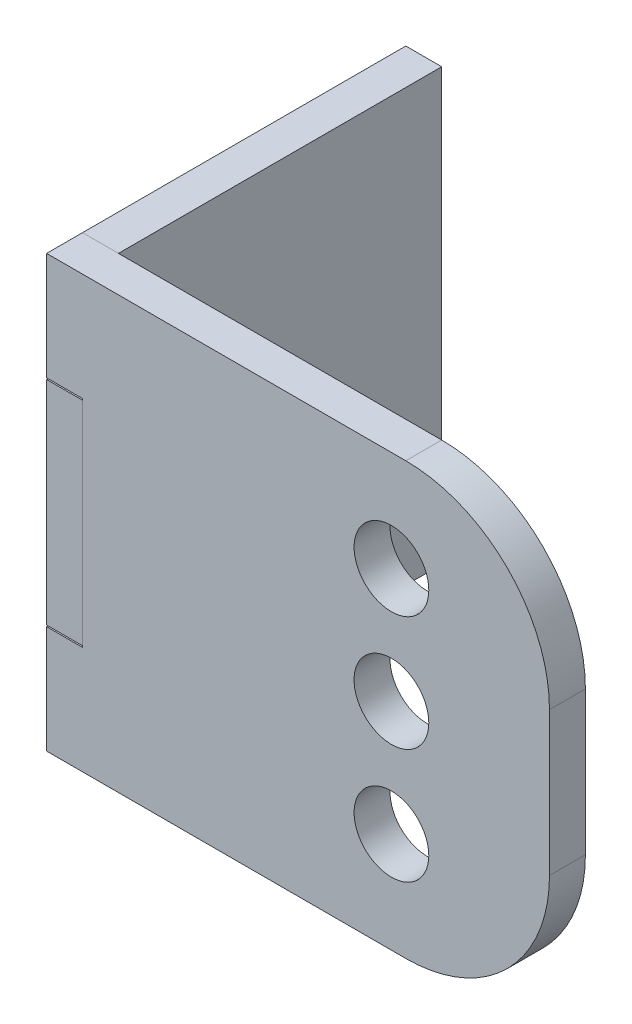
ISO-10303-21;
HEADER;
FILE_DESCRIPTION(('STEP AP214'),'2;1');
FILE_NAME('part.step','',(''),(''),'','','');
FILE_SCHEMA(('AUTOMOTIVE_DESIGN { 1 0 10303 214 1 1 1 1 }'));
ENDSEC;
DATA;
#1=APPLICATION_CONTEXT('core data for automotive mechanical design processes');
#2=APPLICATION_PROTOCOL_DEFINITION('international standard','automotive_design',2000,#1);
#3=PRODUCT_CONTEXT('',#1,'mechanical');
#4=PRODUCT('Part','Part','',(#3));
#5=PRODUCT_RELATED_PRODUCT_CATEGORY('part','',(#4));
#6=PRODUCT_DEFINITION_FORMATION('','',#4);
#7=PRODUCT_DEFINITION_CONTEXT('part definition',#1,'design');
#8=PRODUCT_DEFINITION('design','',#6,#7);
#9=PRODUCT_DEFINITION_SHAPE('','',#8);
#10=(LENGTH_UNIT() NAMED_UNIT(*) SI_UNIT(.MILLI.,.METRE.));
#11=(NAMED_UNIT(*) PLANE_ANGLE_UNIT() SI_UNIT($,.RADIAN.));
#12=(NAMED_UNIT(*) SI_UNIT($,.STERADIAN.) SOLID_ANGLE_UNIT());
#13=UNCERTAINTY_MEASURE_WITH_UNIT(LENGTH_MEASURE(1.E-05),#10,'distance_accuracy_value','');
#14=(GEOMETRIC_REPRESENTATION_CONTEXT(3) GLOBAL_UNCERTAINTY_ASSIGNED_CONTEXT((#13)) GLOBAL_UNIT_ASSIGNED_CONTEXT((#10,
#11,#12)) REPRESENTATION_CONTEXT('',''));
#15=CARTESIAN_POINT('',(0.,0.,0.));
#16=DIRECTION('',(0.,0.,1.));
#17=DIRECTION('',(1.,0.,0.));
#18=AXIS2_PLACEMENT_3D('',#15,#16,#17);
#19=CARTESIAN_POINT('',(0.,0.,0.));
#20=DIRECTION('',(0.,0.,-1.));
#21=DIRECTION('',(-1.,0.,0.));
#22=AXIS2_PLACEMENT_3D('',#19,#20,#21);
#23=PLANE('',#22);
#24=DIRECTION('',(-1.,0.,0.));
#25=VECTOR('',#24,1.);
#26=CARTESIAN_POINT('',(0.,9.398,0.));
#27=LINE('',#26,#25);
#28=CARTESIAN_POINT('',(3.17499999999999,9.398,0.));
#29=VERTEX_POINT('',#28);
#30=CARTESIAN_POINT('',(0.,9.398,0.));
#31=VERTEX_POINT('',#30);
#32=EDGE_CURVE('E76',#29,#31,#27,.T.);
#33=ORIENTED_EDGE('',*,*,#32,.F.);
#34=DIRECTION('',(0.,-1.,0.));
#35=VECTOR('',#34,1.);
#36=CARTESIAN_POINT('',(3.17499999999999,0.,0.));
#37=LINE('',#36,#35);
#38=CARTESIAN_POINT('',(3.17499999999999,19.05,0.));
#39=VERTEX_POINT('',#38);
#40=EDGE_CURVE('E170',#39,#29,#37,.T.);
#41=ORIENTED_EDGE('',*,*,#40,.F.);
#42=DIRECTION('',(1.,0.,0.));
#43=VECTOR('',#42,1.);
#44=CARTESIAN_POINT('',(0.,19.05,0.));
#45=LINE('',#44,#43);
#46=CARTESIAN_POINT('',(0.,19.05,0.));
#47=VERTEX_POINT('',#46);
#48=EDGE_CURVE('E168',#47,#39,#45,.T.);
#49=ORIENTED_EDGE('',*,*,#48,.F.);
#50=DIRECTION('',(0.,1.,0.));
#51=VECTOR('',#50,1.);
#52=CARTESIAN_POINT('',(0.,0.,0.));
#53=LINE('',#52,#51);
#54=EDGE_CURVE('E149',#31,#47,#53,.T.);
#55=ORIENTED_EDGE('',*,*,#54,.F.);
#56=EDGE_LOOP('',(#33,#41,#49,#55));
#57=FACE_BOUND('',#56,.T.);
#58=ADVANCED_FACE('F53',(#57),#23,.F.);
#59=CARTESIAN_POINT('',(0.,0.,-28.575));
#60=DIRECTION('',(1.,0.,0.));
#61=DIRECTION('',(0.,0.,-1.));
#62=AXIS2_PLACEMENT_3D('',#59,#60,#61);
#63=PLANE('',#62);
#64=CARTESIAN_POINT('',(0.,-19.05,0.));
#65=VERTEX_POINT('',#64);
#66=CARTESIAN_POINT('',(0.,-9.398,0.));
#67=VERTEX_POINT('',#66);
#68=EDGE_CURVE('E165',#65,#67,#53,.T.);
#69=ORIENTED_EDGE('',*,*,#68,.T.);
#70=DIRECTION('',(0.,0.,-1.));
#71=VECTOR('',#70,1.);
#72=CARTESIAN_POINT('',(0.,-9.398,3.175));
#73=LINE('',#72,#71);
#74=CARTESIAN_POINT('',(0.,-9.398,3.175));
#75=VERTEX_POINT('',#74);
#76=EDGE_CURVE('E127',#75,#67,#73,.T.);
#77=ORIENTED_EDGE('',*,*,#76,.F.);
#78=DIRECTION('',(0.,-1.,0.));
#79=VECTOR('',#78,1.);
#80=CARTESIAN_POINT('',(0.,0.,3.175));
#81=LINE('',#80,#79);
#82=CARTESIAN_POINT('',(0.,9.398,3.175));
#83=VERTEX_POINT('',#82);
#84=EDGE_CURVE('E140',#83,#75,#81,.T.);
#85=ORIENTED_EDGE('',*,*,#84,.F.);
#86=DIRECTION('',(0.,0.,-1.));
#87=VECTOR('',#86,1.);
#88=CARTESIAN_POINT('',(0.,9.398,3.175));
#89=LINE('',#88,#87);
#90=EDGE_CURVE('E150',#83,#31,#89,.T.);
#91=ORIENTED_EDGE('',*,*,#90,.T.);
#92=ORIENTED_EDGE('',*,*,#54,.T.);
#93=DIRECTION('',(0.,0.,1.));
#94=VECTOR('',#93,1.);
#95=CARTESIAN_POINT('',(0.,19.05,-28.575));
#96=LINE('',#95,#94);
#97=CARTESIAN_POINT('',(0.,19.05,-28.575));
#98=VERTEX_POINT('',#97);
#99=EDGE_CURVE('E12',#98,#47,#96,.T.);
#100=ORIENTED_EDGE('',*,*,#99,.F.);
#101=DIRECTION('',(0.,1.,0.));
#102=VECTOR('',#101,1.);
#103=CARTESIAN_POINT('',(0.,0.,-28.575));
#104=LINE('',#103,#102);
#105=CARTESIAN_POINT('',(0.,-19.05,-28.575));
#106=VERTEX_POINT('',#105);
#107=EDGE_CURVE('E154',#106,#98,#104,.T.);
#108=ORIENTED_EDGE('',*,*,#107,.F.);
#109=DIRECTION('',(0.,0.,1.));
#110=VECTOR('',#109,1.);
#111=CARTESIAN_POINT('',(0.,-19.05,-28.575));
#112=LINE('',#111,#110);
#113=EDGE_CURVE('E164',#106,#65,#112,.T.);
#114=ORIENTED_EDGE('',*,*,#113,.T.);
#115=EDGE_LOOP('',(#69,#77,#85,#91,#92,#100,#108,#114));
#116=FACE_BOUND('',#115,.T.);
#117=ADVANCED_FACE('F55',(#116),#63,.F.);
#118=CARTESIAN_POINT('',(0.,19.05,-28.575));
#119=DIRECTION('',(0.,-1.,0.));
#120=DIRECTION('',(1.,0.,0.));
#121=AXIS2_PLACEMENT_3D('',#118,#119,#120);
#122=PLANE('',#121);
#123=ORIENTED_EDGE('',*,*,#48,.T.);
#124=DIRECTION('',(0.,0.,1.));
#125=VECTOR('',#124,1.);
#126=CARTESIAN_POINT('',(3.17499999999999,19.05,-28.575));
#127=LINE('',#126,#125);
#128=CARTESIAN_POINT('',(3.17499999999999,19.05,-28.575));
#129=VERTEX_POINT('',#128);
#130=EDGE_CURVE('E61',#129,#39,#127,.T.);
#131=ORIENTED_EDGE('',*,*,#130,.F.);
#132=DIRECTION('',(1.,0.,0.));
#133=VECTOR('',#132,1.);
#134=CARTESIAN_POINT('',(0.,19.05,-28.575));
#135=LINE('',#134,#133);
#136=EDGE_CURVE('E157',#98,#129,#135,.T.);
#137=ORIENTED_EDGE('',*,*,#136,.F.);
#138=ORIENTED_EDGE('',*,*,#99,.T.);
#139=EDGE_LOOP('',(#123,#131,#137,#138));
#140=FACE_BOUND('',#139,.T.);
#141=ADVANCED_FACE('F184',(#140),#122,.F.);
#142=CARTESIAN_POINT('',(3.17499999999999,0.,-28.575));
#143=DIRECTION('',(-1.,0.,0.));
#144=DIRECTION('',(0.,0.,1.));
#145=AXIS2_PLACEMENT_3D('',#142,#143,#144);
#146=PLANE('',#145);
#147=ORIENTED_EDGE('',*,*,#40,.T.);
#148=DIRECTION('',(0.,0.,-1.));
#149=VECTOR('',#148,1.);
#150=CARTESIAN_POINT('',(3.175,9.398,3.175));
#151=LINE('',#150,#149);
#152=CARTESIAN_POINT('',(3.175,9.398,3.175));
#153=VERTEX_POINT('',#152);
#154=EDGE_CURVE('E135',#153,#29,#151,.T.);
#155=ORIENTED_EDGE('',*,*,#154,.F.);
#156=DIRECTION('',(0.,1.,0.));
#157=VECTOR('',#156,1.);
#158=CARTESIAN_POINT('',(3.175,0.,3.175));
#159=LINE('',#158,#157);
#160=CARTESIAN_POINT('',(3.175,-9.398,3.175));
#161=VERTEX_POINT('',#160);
#162=EDGE_CURVE('E132',#161,#153,#159,.T.);
#163=ORIENTED_EDGE('',*,*,#162,.F.);
#164=DIRECTION('',(0.,0.,-1.));
#165=VECTOR('',#164,1.);
#166=CARTESIAN_POINT('',(3.175,-9.398,3.175));
#167=LINE('',#166,#165);
#168=CARTESIAN_POINT('',(3.17499999999999,-9.398,0.));
#169=VERTEX_POINT('',#168);
#170=EDGE_CURVE('E119',#161,#169,#167,.T.);
#171=ORIENTED_EDGE('',*,*,#170,.T.);
#172=CARTESIAN_POINT('',(3.17499999999999,-19.05,0.));
#173=VERTEX_POINT('',#172);
#174=EDGE_CURVE('E68',#169,#173,#37,.T.);
#175=ORIENTED_EDGE('',*,*,#174,.T.);
#176=DIRECTION('',(0.,0.,1.));
#177=VECTOR('',#176,1.);
#178=CARTESIAN_POINT('',(3.17499999999999,-19.05,-28.575));
#179=LINE('',#178,#177);
#180=CARTESIAN_POINT('',(3.17499999999999,-19.05,-28.575));
#181=VERTEX_POINT('',#180);
#182=EDGE_CURVE('E175',#181,#173,#179,.T.);
#183=ORIENTED_EDGE('',*,*,#182,.F.);
#184=DIRECTION('',(0.,-1.,0.));
#185=VECTOR('',#184,1.);
#186=CARTESIAN_POINT('',(3.17499999999999,0.,-28.575));
#187=LINE('',#186,#185);
#188=EDGE_CURVE('E160',#129,#181,#187,.T.);
#189=ORIENTED_EDGE('',*,*,#188,.F.);
#190=ORIENTED_EDGE('',*,*,#130,.T.);
#191=EDGE_LOOP('',(#147,#155,#163,#171,#175,#183,#189,#190));
#192=FACE_BOUND('',#191,.T.);
#193=ADVANCED_FACE('F133',(#192),#146,.F.);
#194=CARTESIAN_POINT('',(0.,-19.05,-28.575));
#195=DIRECTION('',(0.,1.,0.));
#196=DIRECTION('',(-1.,0.,0.));
#197=AXIS2_PLACEMENT_3D('',#194,#195,#196);
#198=PLANE('',#197);
#199=DIRECTION('',(-1.,0.,0.));
#200=VECTOR('',#199,1.);
#201=CARTESIAN_POINT('',(0.,-19.05,0.));
#202=LINE('',#201,#200);
#203=EDGE_CURVE('E158',#173,#65,#202,.T.);
#204=ORIENTED_EDGE('',*,*,#203,.T.);
#205=ORIENTED_EDGE('',*,*,#113,.F.);
#206=DIRECTION('',(-1.,0.,0.));
#207=VECTOR('',#206,1.);
#208=CARTESIAN_POINT('',(0.,-19.05,-28.575));
#209=LINE('',#208,#207);
#210=EDGE_CURVE('E162',#181,#106,#209,.T.);
#211=ORIENTED_EDGE('',*,*,#210,.F.);
#212=ORIENTED_EDGE('',*,*,#182,.T.);
#213=EDGE_LOOP('',(#204,#205,#211,#212));
#214=FACE_BOUND('',#213,.T.);
#215=ADVANCED_FACE('F208',(#214),#198,.F.);
#216=CARTESIAN_POINT('',(0.,0.,-28.575));
#217=DIRECTION('',(0.,0.,-1.));
#218=DIRECTION('',(-1.,0.,0.));
#219=AXIS2_PLACEMENT_3D('',#216,#217,#218);
#220=PLANE('',#219);
#221=ORIENTED_EDGE('',*,*,#107,.T.);
#222=ORIENTED_EDGE('',*,*,#136,.T.);
#223=ORIENTED_EDGE('',*,*,#188,.T.);
#224=ORIENTED_EDGE('',*,*,#210,.T.);
#225=EDGE_LOOP('',(#221,#222,#223,#224));
#226=FACE_BOUND('',#225,.T.);
#227=ADVANCED_FACE('F198',(#226),#220,.T.);
#228=ORIENTED_EDGE('',*,*,#174,.F.);
#229=DIRECTION('',(-1.,0.,0.));
#230=VECTOR('',#229,1.);
#231=CARTESIAN_POINT('',(0.,-9.398,0.));
#232=LINE('',#231,#230);
#233=EDGE_CURVE('E125',#169,#67,#232,.T.);
#234=ORIENTED_EDGE('',*,*,#233,.T.);
#235=ORIENTED_EDGE('',*,*,#68,.F.);
#236=ORIENTED_EDGE('',*,*,#203,.F.);
#237=EDGE_LOOP('',(#228,#234,#235,#236));
#238=FACE_BOUND('',#237,.T.);
#239=ADVANCED_FACE('F191',(#238),#23,.F.);
#240=CARTESIAN_POINT('',(0.,9.398,3.175));
#241=DIRECTION('',(0.,-1.,0.));
#242=DIRECTION('',(0.,0.,-1.));
#243=AXIS2_PLACEMENT_3D('',#240,#241,#242);
#244=PLANE('',#243);
#245=ORIENTED_EDGE('',*,*,#32,.T.);
#246=ORIENTED_EDGE('',*,*,#90,.F.);
#247=DIRECTION('',(-1.,0.,0.));
#248=VECTOR('',#247,1.);
#249=CARTESIAN_POINT('',(0.,9.398,3.175));
#250=LINE('',#249,#248);
#251=EDGE_CURVE('E128',#153,#83,#250,.T.);
#252=ORIENTED_EDGE('',*,*,#251,.F.);
#253=ORIENTED_EDGE('',*,*,#154,.T.);
#254=EDGE_LOOP('',(#245,#246,#252,#253));
#255=FACE_BOUND('',#254,.T.);
#256=ADVANCED_FACE('F189',(#255),#244,.F.);
#257=CARTESIAN_POINT('',(0.,-9.398,3.175));
#258=DIRECTION('',(0.,-1.,0.));
#259=DIRECTION('',(0.,0.,-1.));
#260=AXIS2_PLACEMENT_3D('',#257,#258,#259);
#261=PLANE('',#260);
#262=ORIENTED_EDGE('',*,*,#233,.F.);
#263=ORIENTED_EDGE('',*,*,#170,.F.);
#264=DIRECTION('',(-1.,0.,0.));
#265=VECTOR('',#264,1.);
#266=CARTESIAN_POINT('',(0.,-9.398,3.175));
#267=LINE('',#266,#265);
#268=EDGE_CURVE('E124',#161,#75,#267,.T.);
#269=ORIENTED_EDGE('',*,*,#268,.T.);
#270=ORIENTED_EDGE('',*,*,#76,.T.);
#271=EDGE_LOOP('',(#262,#263,#269,#270));
#272=FACE_BOUND('',#271,.T.);
#273=ADVANCED_FACE('F121',(#272),#261,.T.);
#274=CARTESIAN_POINT('',(0.,0.,3.175));
#275=DIRECTION('',(0.,0.,-1.));
#276=DIRECTION('',(-1.,0.,0.));
#277=AXIS2_PLACEMENT_3D('',#274,#275,#276);
#278=PLANE('',#277);
#279=ORIENTED_EDGE('',*,*,#162,.T.);
#280=ORIENTED_EDGE('',*,*,#251,.T.);
#281=ORIENTED_EDGE('',*,*,#84,.T.);
#282=ORIENTED_EDGE('',*,*,#268,.F.);
#283=EDGE_LOOP('',(#279,#280,#281,#282));
#284=FACE_BOUND('',#283,.T.);
#285=ADVANCED_FACE('F138',(#284),#278,.F.);
#286=CLOSED_SHELL('',(#58,#117,#141,#193,#215,#227,#239,#256,#273,#285));
#287=MANIFOLD_SOLID_BREP('B2',#286);
#288=CARTESIAN_POINT('',(3.175,0.,3.175));
#289=DIRECTION('',(1.,0.,0.));
#290=DIRECTION('',(0.,1.,0.));
#291=AXIS2_PLACEMENT_3D('',#288,#289,#290);
#292=PLANE('',#291);
#293=DIRECTION('',(0.,-1.,0.));
#294=VECTOR('',#293,1.);
#295=CARTESIAN_POINT('',(3.175,0.,0.));
#296=LINE('',#295,#294);
#297=CARTESIAN_POINT('',(3.175,9.525,0.));
#298=VERTEX_POINT('',#297);
#299=CARTESIAN_POINT('',(3.175,-9.525,0.));
#300=VERTEX_POINT('',#299);
#301=EDGE_CURVE('E441',#298,#300,#296,.T.);
#302=ORIENTED_EDGE('',*,*,#301,.T.);
#303=DIRECTION('',(0.,0.,-1.));
#304=VECTOR('',#303,1.);
#305=CARTESIAN_POINT('',(3.175,-9.525,3.175));
#306=LINE('',#305,#304);
#307=CARTESIAN_POINT('',(3.175,-9.525,3.175));
#308=VERTEX_POINT('',#307);
#309=EDGE_CURVE('E423',#308,#300,#306,.T.);
#310=ORIENTED_EDGE('',*,*,#309,.F.);
#311=DIRECTION('',(0.,-1.,0.));
#312=VECTOR('',#311,1.);
#313=CARTESIAN_POINT('',(3.175,0.,3.175));
#314=LINE('',#313,#312);
#315=CARTESIAN_POINT('',(3.175,9.525,3.175));
#316=VERTEX_POINT('',#315);
#317=EDGE_CURVE('E429',#316,#308,#314,.T.);
#318=ORIENTED_EDGE('',*,*,#317,.F.);
#319=DIRECTION('',(0.,0.,-1.));
#320=VECTOR('',#319,1.);
#321=CARTESIAN_POINT('',(3.175,9.525,3.175));
#322=LINE('',#321,#320);
#323=EDGE_CURVE('E492',#316,#298,#322,.T.);
#324=ORIENTED_EDGE('',*,*,#323,.T.);
#325=EDGE_LOOP('',(#302,#310,#318,#324));
#326=FACE_BOUND('',#325,.T.);
#327=ADVANCED_FACE('F338',(#326),#292,.F.);
#328=CARTESIAN_POINT('',(0.,-9.525,3.175));
#329=DIRECTION('',(0.,-1.,0.));
#330=DIRECTION('',(0.,0.,-1.));
#331=AXIS2_PLACEMENT_3D('',#328,#329,#330);
#332=PLANE('',#331);
#333=DIRECTION('',(-1.,0.,0.));
#334=VECTOR('',#333,1.);
#335=CARTESIAN_POINT('',(0.,-9.525,0.));
#336=LINE('',#335,#334);
#337=CARTESIAN_POINT('',(0.,-9.525,0.));
#338=VERTEX_POINT('',#337);
#339=EDGE_CURVE('E484',#300,#338,#336,.T.);
#340=ORIENTED_EDGE('',*,*,#339,.T.);
#341=DIRECTION('',(0.,0.,-1.));
#342=VECTOR('',#341,1.);
#343=CARTESIAN_POINT('',(0.,-9.525,3.175));
#344=LINE('',#343,#342);
#345=CARTESIAN_POINT('',(0.,-9.525,3.175));
#346=VERTEX_POINT('',#345);
#347=EDGE_CURVE('E426',#346,#338,#344,.T.);
#348=ORIENTED_EDGE('',*,*,#347,.F.);
#349=DIRECTION('',(-1.,0.,0.));
#350=VECTOR('',#349,1.);
#351=CARTESIAN_POINT('',(0.,-9.525,3.175));
#352=LINE('',#351,#350);
#353=EDGE_CURVE('E419',#308,#346,#352,.T.);
#354=ORIENTED_EDGE('',*,*,#353,.F.);
#355=ORIENTED_EDGE('',*,*,#309,.T.);
#356=EDGE_LOOP('',(#340,#348,#354,#355));
#357=FACE_BOUND('',#356,.T.);
#358=ADVANCED_FACE('F421',(#357),#332,.F.);
#359=CARTESIAN_POINT('',(0.,0.,3.175));
#360=DIRECTION('',(1.,0.,0.));
#361=DIRECTION('',(0.,0.,-1.));
#362=AXIS2_PLACEMENT_3D('',#359,#360,#361);
#363=PLANE('',#362);
#364=DIRECTION('',(0.,-1.,0.));
#365=VECTOR('',#364,1.);
#366=CARTESIAN_POINT('',(0.,0.,0.));
#367=LINE('',#366,#365);
#368=CARTESIAN_POINT('',(0.,-19.05,0.));
#369=VERTEX_POINT('',#368);
#370=EDGE_CURVE('E480',#338,#369,#367,.T.);
#371=ORIENTED_EDGE('',*,*,#370,.T.);
#372=DIRECTION('',(0.,0.,-1.));
#373=VECTOR('',#372,1.);
#374=CARTESIAN_POINT('',(0.,-19.05,3.175));
#375=LINE('',#374,#373);
#376=CARTESIAN_POINT('',(0.,-19.05,3.175));
#377=VERTEX_POINT('',#376);
#378=EDGE_CURVE('E446',#377,#369,#375,.T.);
#379=ORIENTED_EDGE('',*,*,#378,.F.);
#380=DIRECTION('',(0.,-1.,0.));
#381=VECTOR('',#380,1.);
#382=CARTESIAN_POINT('',(0.,0.,3.175));
#383=LINE('',#382,#381);
#384=EDGE_CURVE('E428',#346,#377,#383,.T.);
#385=ORIENTED_EDGE('',*,*,#384,.F.);
#386=ORIENTED_EDGE('',*,*,#347,.T.);
#387=EDGE_LOOP('',(#371,#379,#385,#386));
#388=FACE_BOUND('',#387,.T.);
#389=ADVANCED_FACE('F520',(#388),#363,.F.);
#390=CARTESIAN_POINT('',(0.,-19.05,3.175));
#391=DIRECTION('',(0.,1.,0.));
#392=DIRECTION('',(-1.,0.,0.));
#393=AXIS2_PLACEMENT_3D('',#390,#391,#392);
#394=PLANE('',#393);
#395=DIRECTION('',(1.,0.,0.));
#396=VECTOR('',#395,1.);
#397=CARTESIAN_POINT('',(0.,-19.05,0.));
#398=LINE('',#397,#396);
#399=CARTESIAN_POINT('',(31.75,-19.05,0.));
#400=VERTEX_POINT('',#399);
#401=EDGE_CURVE('E475',#369,#400,#398,.T.);
#402=ORIENTED_EDGE('',*,*,#401,.T.);
#403=DIRECTION('',(0.,0.,-1.));
#404=VECTOR('',#403,1.);
#405=CARTESIAN_POINT('',(31.75,-19.05,3.175));
#406=LINE('',#405,#404);
#407=CARTESIAN_POINT('',(31.75,-19.05,3.175));
#408=VERTEX_POINT('',#407);
#409=EDGE_CURVE('E361',#400,#408,#406,.F.);
#410=ORIENTED_EDGE('',*,*,#409,.T.);
#411=DIRECTION('',(1.,0.,0.));
#412=VECTOR('',#411,1.);
#413=CARTESIAN_POINT('',(0.,-19.05,3.175));
#414=LINE('',#413,#412);
#415=EDGE_CURVE('E460',#377,#408,#414,.T.);
#416=ORIENTED_EDGE('',*,*,#415,.F.);
#417=ORIENTED_EDGE('',*,*,#378,.T.);
#418=EDGE_LOOP('',(#402,#410,#416,#417));
#419=FACE_BOUND('',#418,.T.);
#420=ADVANCED_FACE('F478',(#419),#394,.F.);
#421=CARTESIAN_POINT('',(44.45,0.,3.175));
#422=DIRECTION('',(1.,0.,0.));
#423=DIRECTION('',(0.,0.,-1.));
#424=AXIS2_PLACEMENT_3D('',#421,#422,#423);
#425=PLANE('',#424);
#426=DIRECTION('',(0.,-1.,0.));
#427=VECTOR('',#426,1.);
#428=CARTESIAN_POINT('',(44.45,0.,3.175));
#429=LINE('',#428,#427);
#430=CARTESIAN_POINT('',(44.45,6.35,3.175));
#431=VERTEX_POINT('',#430);
#432=CARTESIAN_POINT('',(44.45,-6.35,3.175));
#433=VERTEX_POINT('',#432);
#434=EDGE_CURVE('E459',#431,#433,#429,.T.);
#435=ORIENTED_EDGE('',*,*,#434,.T.);
#436=DIRECTION('',(0.,0.,-1.));
#437=VECTOR('',#436,1.);
#438=CARTESIAN_POINT('',(44.45,-6.35,0.));
#439=LINE('',#438,#437);
#440=CARTESIAN_POINT('',(44.45,-6.35,0.));
#441=VERTEX_POINT('',#440);
#442=EDGE_CURVE('E444',#433,#441,#439,.T.);
#443=ORIENTED_EDGE('',*,*,#442,.T.);
#444=DIRECTION('',(0.,-1.,0.));
#445=VECTOR('',#444,1.);
#446=CARTESIAN_POINT('',(44.45,0.,0.));
#447=LINE('',#446,#445);
#448=CARTESIAN_POINT('',(44.45,6.35,0.));
#449=VERTEX_POINT('',#448);
#450=EDGE_CURVE('E476',#449,#441,#447,.T.);
#451=ORIENTED_EDGE('',*,*,#450,.F.);
#452=DIRECTION('',(0.,0.,-1.));
#453=VECTOR('',#452,1.);
#454=CARTESIAN_POINT('',(44.45,6.35,3.175));
#455=LINE('',#454,#453);
#456=EDGE_CURVE('E442',#449,#431,#455,.F.);
#457=ORIENTED_EDGE('',*,*,#456,.T.);
#458=EDGE_LOOP('',(#435,#443,#451,#457));
#459=FACE_BOUND('',#458,.T.);
#460=ADVANCED_FACE('F464',(#459),#425,.T.);
#461=CARTESIAN_POINT('',(0.,19.05,3.175));
#462=DIRECTION('',(0.,1.,0.));
#463=DIRECTION('',(-1.,0.,0.));
#464=AXIS2_PLACEMENT_3D('',#461,#462,#463);
#465=PLANE('',#464);
#466=DIRECTION('',(1.,0.,0.));
#467=VECTOR('',#466,1.);
#468=CARTESIAN_POINT('',(0.,19.05,3.175));
#469=LINE('',#468,#467);
#470=CARTESIAN_POINT('',(0.,19.05,3.175));
#471=VERTEX_POINT('',#470);
#472=CARTESIAN_POINT('',(31.75,19.05,3.175));
#473=VERTEX_POINT('',#472);
#474=EDGE_CURVE('E468',#471,#473,#469,.T.);
#475=ORIENTED_EDGE('',*,*,#474,.T.);
#476=DIRECTION('',(0.,0.,-1.));
#477=VECTOR('',#476,1.);
#478=CARTESIAN_POINT('',(31.75,19.05,3.175));
#479=LINE('',#478,#477);
#480=CARTESIAN_POINT('',(31.75,19.05,0.));
#481=VERTEX_POINT('',#480);
#482=EDGE_CURVE('E51',#473,#481,#479,.T.);
#483=ORIENTED_EDGE('',*,*,#482,.T.);
#484=DIRECTION('',(1.,0.,0.));
#485=VECTOR('',#484,1.);
#486=CARTESIAN_POINT('',(0.,19.05,0.));
#487=LINE('',#486,#485);
#488=CARTESIAN_POINT('',(0.,19.05,0.));
#489=VERTEX_POINT('',#488);
#490=EDGE_CURVE('E482',#489,#481,#487,.T.);
#491=ORIENTED_EDGE('',*,*,#490,.F.);
#492=DIRECTION('',(0.,0.,-1.));
#493=VECTOR('',#492,1.);
#494=CARTESIAN_POINT('',(0.,19.05,3.175));
#495=LINE('',#494,#493);
#496=EDGE_CURVE('E497',#471,#489,#495,.T.);
#497=ORIENTED_EDGE('',*,*,#496,.F.);
#498=EDGE_LOOP('',(#475,#483,#491,#497));
#499=FACE_BOUND('',#498,.T.);
#500=ADVANCED_FACE('F507',(#499),#465,.T.);
#501=CARTESIAN_POINT('',(0.,9.525,0.));
#502=VERTEX_POINT('',#501);
#503=EDGE_CURVE('E486',#489,#502,#367,.T.);
#504=ORIENTED_EDGE('',*,*,#503,.T.);
#505=DIRECTION('',(0.,0.,-1.));
#506=VECTOR('',#505,1.);
#507=CARTESIAN_POINT('',(0.,9.525,3.175));
#508=LINE('',#507,#506);
#509=CARTESIAN_POINT('',(0.,9.525,3.175));
#510=VERTEX_POINT('',#509);
#511=EDGE_CURVE('E494',#510,#502,#508,.T.);
#512=ORIENTED_EDGE('',*,*,#511,.F.);
#513=EDGE_CURVE('E503',#471,#510,#383,.T.);
#514=ORIENTED_EDGE('',*,*,#513,.F.);
#515=ORIENTED_EDGE('',*,*,#496,.T.);
#516=EDGE_LOOP('',(#504,#512,#514,#515));
#517=FACE_BOUND('',#516,.T.);
#518=ADVANCED_FACE('F501',(#517),#363,.F.);
#519=CARTESIAN_POINT('',(0.,9.525,3.175));
#520=DIRECTION('',(0.,1.,0.));
#521=DIRECTION('',(0.,0.,1.));
#522=AXIS2_PLACEMENT_3D('',#519,#520,#521);
#523=PLANE('',#522);
#524=DIRECTION('',(1.,0.,0.));
#525=VECTOR('',#524,1.);
#526=CARTESIAN_POINT('',(0.,9.525,0.));
#527=LINE('',#526,#525);
#528=EDGE_CURVE('E438',#502,#298,#527,.T.);
#529=ORIENTED_EDGE('',*,*,#528,.T.);
#530=ORIENTED_EDGE('',*,*,#323,.F.);
#531=DIRECTION('',(1.,0.,0.));
#532=VECTOR('',#531,1.);
#533=CARTESIAN_POINT('',(0.,9.525,3.175));
#534=LINE('',#533,#532);
#535=EDGE_CURVE('E434',#510,#316,#534,.T.);
#536=ORIENTED_EDGE('',*,*,#535,.F.);
#537=ORIENTED_EDGE('',*,*,#511,.T.);
#538=EDGE_LOOP('',(#529,#530,#536,#537));
#539=FACE_BOUND('',#538,.T.);
#540=ADVANCED_FACE('F531',(#539),#523,.F.);
#541=CARTESIAN_POINT('',(0.,0.,3.175));
#542=DIRECTION('',(0.,0.,1.));
#543=DIRECTION('',(1.,0.,0.));
#544=AXIS2_PLACEMENT_3D('',#541,#542,#543);
#545=PLANE('',#544);
#546=CARTESIAN_POINT('',(30.48,10.16,3.175));
#547=DIRECTION('',(0.,0.,1.));
#548=DIRECTION('',(1.,0.,0.));
#549=AXIS2_PLACEMENT_3D('',#546,#547,#548);
#550=CIRCLE('',#549,3.30199999999998);
#551=CARTESIAN_POINT('',(33.782,10.16,3.175));
#552=VERTEX_POINT('',#551);
#553=EDGE_CURVE('E556',#552,#552,#550,.T.);
#554=ORIENTED_EDGE('',*,*,#553,.F.);
#555=EDGE_LOOP('',(#554));
#556=FACE_BOUND('',#555,.T.);
#557=CARTESIAN_POINT('',(30.48,-10.16,3.175));
#558=DIRECTION('',(0.,0.,1.));
#559=DIRECTION('',(1.,0.,0.));
#560=AXIS2_PLACEMENT_3D('',#557,#558,#559);
#561=CIRCLE('',#560,3.30199999999998);
#562=CARTESIAN_POINT('',(33.782,-10.16,3.175));
#563=VERTEX_POINT('',#562);
#564=EDGE_CURVE('E564',#563,#563,#561,.T.);
#565=ORIENTED_EDGE('',*,*,#564,.F.);
#566=EDGE_LOOP('',(#565));
#567=FACE_BOUND('',#566,.T.);
#568=CARTESIAN_POINT('',(30.48,0.,3.175));
#569=DIRECTION('',(0.,0.,1.));
#570=DIRECTION('',(1.,0.,0.));
#571=AXIS2_PLACEMENT_3D('',#568,#569,#570);
#572=CIRCLE('',#571,3.302);
#573=CARTESIAN_POINT('',(33.782,0.,3.175));
#574=VERTEX_POINT('',#573);
#575=EDGE_CURVE('E560',#574,#574,#572,.T.);
#576=ORIENTED_EDGE('',*,*,#575,.F.);
#577=EDGE_LOOP('',(#576));
#578=FACE_BOUND('',#577,.T.);
#579=ORIENTED_EDGE('',*,*,#415,.T.);
#580=CARTESIAN_POINT('',(31.75,-6.35,3.175));
#581=DIRECTION('',(0.,0.,1.));
#582=DIRECTION('',(1.,0.,0.));
#583=AXIS2_PLACEMENT_3D('',#580,#581,#582);
#584=CIRCLE('',#583,12.7);
#585=EDGE_CURVE('E346',#408,#433,#584,.T.);
#586=ORIENTED_EDGE('',*,*,#585,.T.);
#587=ORIENTED_EDGE('',*,*,#434,.F.);
#588=CARTESIAN_POINT('',(31.75,6.35,3.175));
#589=DIRECTION('',(0.,0.,1.));
#590=DIRECTION('',(1.,0.,0.));
#591=AXIS2_PLACEMENT_3D('',#588,#589,#590);
#592=CIRCLE('',#591,12.7);
#593=EDGE_CURVE('E353',#431,#473,#592,.T.);
#594=ORIENTED_EDGE('',*,*,#593,.T.);
#595=ORIENTED_EDGE('',*,*,#474,.F.);
#596=ORIENTED_EDGE('',*,*,#513,.T.);
#597=ORIENTED_EDGE('',*,*,#535,.T.);
#598=ORIENTED_EDGE('',*,*,#317,.T.);
#599=ORIENTED_EDGE('',*,*,#353,.T.);
#600=ORIENTED_EDGE('',*,*,#384,.T.);
#601=EDGE_LOOP('',(#579,#586,#587,#594,#595,#596,#597,#598,#599,#600));
#602=FACE_BOUND('',#601,.T.);
#603=ADVANCED_FACE('F432',(#556,#567,#578,#602),#545,.T.);
#604=CARTESIAN_POINT('',(0.,0.,0.));
#605=DIRECTION('',(0.,0.,1.));
#606=DIRECTION('',(1.,0.,0.));
#607=AXIS2_PLACEMENT_3D('',#604,#605,#606);
#608=PLANE('',#607);
#609=CARTESIAN_POINT('',(30.48,10.16,0.));
#610=DIRECTION('',(0.,0.,1.));
#611=DIRECTION('',(1.,0.,0.));
#612=AXIS2_PLACEMENT_3D('',#609,#610,#611);
#613=CIRCLE('',#612,3.30199999999998);
#614=CARTESIAN_POINT('',(33.782,10.16,0.));
#615=VERTEX_POINT('',#614);
#616=EDGE_CURVE('E559',#615,#615,#613,.T.);
#617=ORIENTED_EDGE('',*,*,#616,.T.);
#618=EDGE_LOOP('',(#617));
#619=FACE_BOUND('',#618,.T.);
#620=CARTESIAN_POINT('',(30.48,-10.16,0.));
#621=DIRECTION('',(0.,0.,1.));
#622=DIRECTION('',(1.,0.,0.));
#623=AXIS2_PLACEMENT_3D('',#620,#621,#622);
#624=CIRCLE('',#623,3.30199999999998);
#625=CARTESIAN_POINT('',(33.782,-10.16,0.));
#626=VERTEX_POINT('',#625);
#627=EDGE_CURVE('E561',#626,#626,#624,.T.);
#628=ORIENTED_EDGE('',*,*,#627,.T.);
#629=EDGE_LOOP('',(#628));
#630=FACE_BOUND('',#629,.T.);
#631=CARTESIAN_POINT('',(30.48,0.,0.));
#632=DIRECTION('',(0.,0.,1.));
#633=DIRECTION('',(1.,0.,0.));
#634=AXIS2_PLACEMENT_3D('',#631,#632,#633);
#635=CIRCLE('',#634,3.302);
#636=CARTESIAN_POINT('',(33.782,0.,0.));
#637=VERTEX_POINT('',#636);
#638=EDGE_CURVE('E567',#637,#637,#635,.T.);
#639=ORIENTED_EDGE('',*,*,#638,.T.);
#640=EDGE_LOOP('',(#639));
#641=FACE_BOUND('',#640,.T.);
#642=ORIENTED_EDGE('',*,*,#450,.T.);
#643=CARTESIAN_POINT('',(31.75,-6.35,0.));
#644=DIRECTION('',(0.,0.,1.));
#645=DIRECTION('',(1.,0.,0.));
#646=AXIS2_PLACEMENT_3D('',#643,#644,#645);
#647=CIRCLE('',#646,12.7);
#648=EDGE_CURVE('E454',#441,#400,#647,.F.);
#649=ORIENTED_EDGE('',*,*,#648,.T.);
#650=ORIENTED_EDGE('',*,*,#401,.F.);
#651=ORIENTED_EDGE('',*,*,#370,.F.);
#652=ORIENTED_EDGE('',*,*,#339,.F.);
#653=ORIENTED_EDGE('',*,*,#301,.F.);
#654=ORIENTED_EDGE('',*,*,#528,.F.);
#655=ORIENTED_EDGE('',*,*,#503,.F.);
#656=ORIENTED_EDGE('',*,*,#490,.T.);
#657=CARTESIAN_POINT('',(31.75,6.35,0.));
#658=DIRECTION('',(0.,0.,1.));
#659=DIRECTION('',(1.,0.,0.));
#660=AXIS2_PLACEMENT_3D('',#657,#658,#659);
#661=CIRCLE('',#660,12.7);
#662=EDGE_CURVE('E452',#481,#449,#661,.F.);
#663=ORIENTED_EDGE('',*,*,#662,.T.);
#664=EDGE_LOOP('',(#642,#649,#650,#651,#652,#653,#654,#655,#656,#663));
#665=FACE_BOUND('',#664,.T.);
#666=ADVANCED_FACE('F473',(#619,#630,#641,#665),#608,.F.);
#667=CARTESIAN_POINT('',(30.48,0.,0.));
#668=DIRECTION('',(0.,0.,1.));
#669=DIRECTION('',(1.,0.,0.));
#670=AXIS2_PLACEMENT_3D('',#667,#668,#669);
#671=CYLINDRICAL_SURFACE('',#670,3.302);
#672=ORIENTED_EDGE('',*,*,#575,.T.);
#673=EDGE_LOOP('',(#672));
#674=FACE_BOUND('',#673,.T.);
#675=ORIENTED_EDGE('',*,*,#638,.F.);
#676=EDGE_LOOP('',(#675));
#677=FACE_BOUND('',#676,.T.);
#678=ADVANCED_FACE('F537',(#674,#677),#671,.F.);
#679=CARTESIAN_POINT('',(30.48,-10.16,0.));
#680=DIRECTION('',(0.,0.,1.));
#681=DIRECTION('',(1.,0.,0.));
#682=AXIS2_PLACEMENT_3D('',#679,#680,#681);
#683=CYLINDRICAL_SURFACE('',#682,3.30199999999998);
#684=ORIENTED_EDGE('',*,*,#564,.T.);
#685=EDGE_LOOP('',(#684));
#686=FACE_BOUND('',#685,.T.);
#687=ORIENTED_EDGE('',*,*,#627,.F.);
#688=EDGE_LOOP('',(#687));
#689=FACE_BOUND('',#688,.T.);
#690=ADVANCED_FACE('F544',(#686,#689),#683,.F.);
#691=CARTESIAN_POINT('',(30.48,10.16,0.));
#692=DIRECTION('',(0.,0.,1.));
#693=DIRECTION('',(1.,0.,0.));
#694=AXIS2_PLACEMENT_3D('',#691,#692,#693);
#695=CYLINDRICAL_SURFACE('',#694,3.30199999999998);
#696=ORIENTED_EDGE('',*,*,#553,.T.);
#697=EDGE_LOOP('',(#696));
#698=FACE_BOUND('',#697,.T.);
#699=ORIENTED_EDGE('',*,*,#616,.F.);
#700=EDGE_LOOP('',(#699));
#701=FACE_BOUND('',#700,.T.);
#702=ADVANCED_FACE('F514',(#698,#701),#695,.F.);
#703=CARTESIAN_POINT('',(31.75,-6.35,3.175));
#704=DIRECTION('',(0.,0.,1.));
#705=DIRECTION('',(1.,0.,0.));
#706=AXIS2_PLACEMENT_3D('',#703,#704,#705);
#707=CYLINDRICAL_SURFACE('',#706,12.7);
#708=ORIENTED_EDGE('',*,*,#585,.F.);
#709=ORIENTED_EDGE('',*,*,#409,.F.);
#710=ORIENTED_EDGE('',*,*,#648,.F.);
#711=ORIENTED_EDGE('',*,*,#442,.F.);
#712=EDGE_LOOP('',(#708,#709,#710,#711));
#713=FACE_BOUND('',#712,.T.);
#714=ADVANCED_FACE('F470',(#713),#707,.T.);
#715=CARTESIAN_POINT('',(31.75,6.35,3.175));
#716=DIRECTION('',(0.,0.,-1.));
#717=DIRECTION('',(-1.,0.,0.));
#718=AXIS2_PLACEMENT_3D('',#715,#716,#717);
#719=CYLINDRICAL_SURFACE('',#718,12.7);
#720=ORIENTED_EDGE('',*,*,#593,.F.);
#721=ORIENTED_EDGE('',*,*,#456,.F.);
#722=ORIENTED_EDGE('',*,*,#662,.F.);
#723=ORIENTED_EDGE('',*,*,#482,.F.);
#724=EDGE_LOOP('',(#720,#721,#722,#723));
#725=FACE_BOUND('',#724,.T.);
#726=ADVANCED_FACE('F340',(#725),#719,.T.);
#727=CLOSED_SHELL('',(#327,#358,#389,#420,#460,#500,#518,#540,#603,#666,#678,#690,#702,#714,#726));
#728=MANIFOLD_SOLID_BREP('B6',#727);
#729=ADVANCED_BREP_SHAPE_REPRESENTATION('',(#18,#287,#728),#14);
#730=SHAPE_DEFINITION_REPRESENTATION(#9,#729);
ENDSEC;
END-ISO-10303-21;
